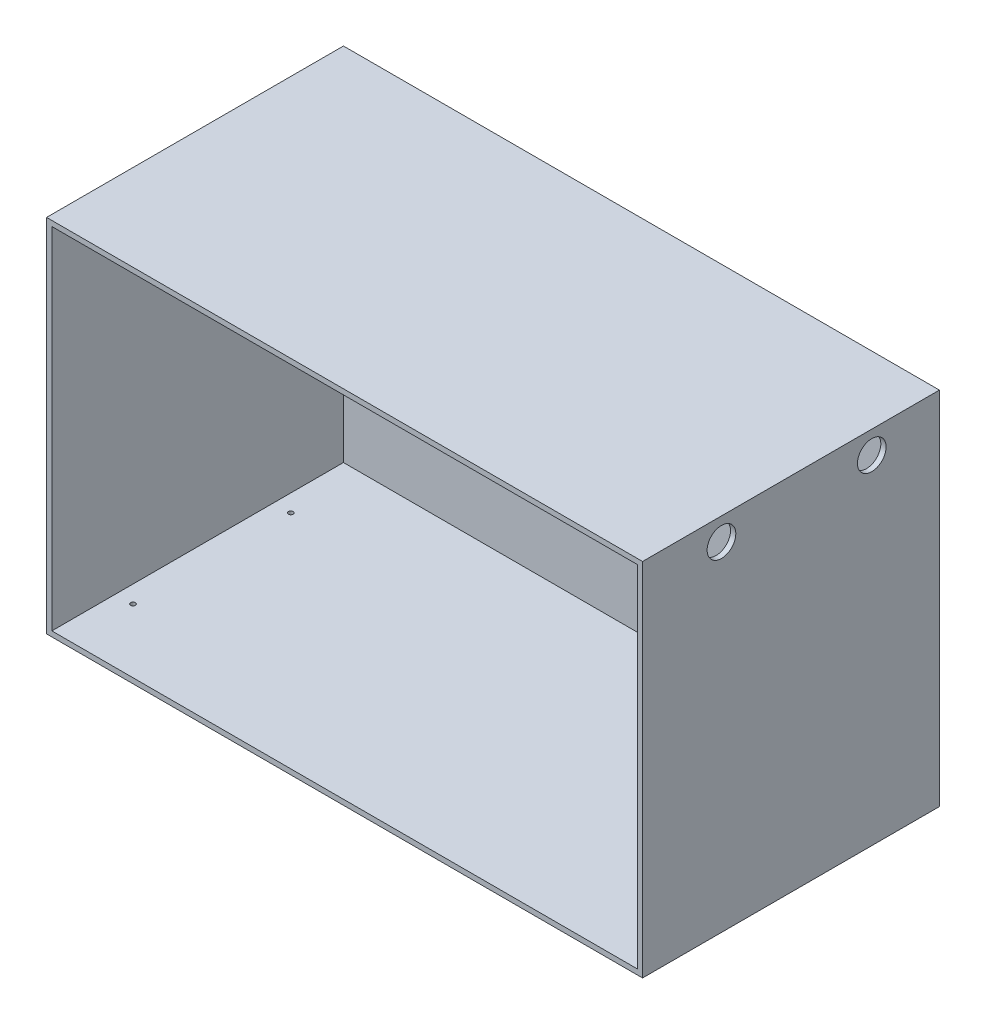
ISO-10303-21;
HEADER;
FILE_DESCRIPTION(('STEP AP214'),'2;1');
FILE_NAME('part.step','',(''),(''),'','','');
FILE_SCHEMA(('AUTOMOTIVE_DESIGN { 1 0 10303 214 1 1 1 1 }'));
ENDSEC;
DATA;
#1=APPLICATION_CONTEXT('core data for automotive mechanical design processes');
#2=APPLICATION_PROTOCOL_DEFINITION('international standard','automotive_design',2000,#1);
#3=PRODUCT_CONTEXT('',#1,'mechanical');
#4=PRODUCT('Part','Part','',(#3));
#5=PRODUCT_RELATED_PRODUCT_CATEGORY('part','',(#4));
#6=PRODUCT_DEFINITION_FORMATION('','',#4);
#7=PRODUCT_DEFINITION_CONTEXT('part definition',#1,'design');
#8=PRODUCT_DEFINITION('design','',#6,#7);
#9=PRODUCT_DEFINITION_SHAPE('','',#8);
#10=(LENGTH_UNIT() NAMED_UNIT(*) SI_UNIT(.MILLI.,.METRE.));
#11=(NAMED_UNIT(*) PLANE_ANGLE_UNIT() SI_UNIT($,.RADIAN.));
#12=(NAMED_UNIT(*) SI_UNIT($,.STERADIAN.) SOLID_ANGLE_UNIT());
#13=UNCERTAINTY_MEASURE_WITH_UNIT(LENGTH_MEASURE(1.E-05),#10,'distance_accuracy_value','');
#14=(GEOMETRIC_REPRESENTATION_CONTEXT(3) GLOBAL_UNCERTAINTY_ASSIGNED_CONTEXT((#13)) GLOBAL_UNIT_ASSIGNED_CONTEXT((#10,
#11,#12)) REPRESENTATION_CONTEXT('',''));
#15=CARTESIAN_POINT('',(0.,0.,0.));
#16=DIRECTION('',(0.,0.,1.));
#17=DIRECTION('',(1.,0.,0.));
#18=AXIS2_PLACEMENT_3D('',#15,#16,#17);
#19=CARTESIAN_POINT('',(396.5,480.,-220.));
#20=DIRECTION('',(-1.,0.,0.));
#21=DIRECTION('',(0.,0.,1.));
#22=AXIS2_PLACEMENT_3D('',#19,#20,#21);
#23=PLANE('',#22);
#24=CARTESIAN_POINT('',(396.5,450.,70.));
#25=DIRECTION('',(-1.,0.,0.));
#26=DIRECTION('',(0.,0.,1.));
#27=AXIS2_PLACEMENT_3D('',#24,#25,#26);
#28=CIRCLE('',#27,19.05);
#29=CARTESIAN_POINT('',(396.5,450.,89.05));
#30=VERTEX_POINT('',#29);
#31=EDGE_CURVE('E169',#30,#30,#28,.T.);
#32=ORIENTED_EDGE('',*,*,#31,.T.);
#33=EDGE_LOOP('',(#32));
#34=FACE_BOUND('',#33,.T.);
#35=CARTESIAN_POINT('',(396.5,450.,-130.));
#36=DIRECTION('',(-1.,0.,0.));
#37=DIRECTION('',(0.,0.,1.));
#38=AXIS2_PLACEMENT_3D('',#35,#36,#37);
#39=CIRCLE('',#38,19.05);
#40=CARTESIAN_POINT('',(396.5,450.,-110.95));
#41=VERTEX_POINT('',#40);
#42=EDGE_CURVE('E176',#41,#41,#39,.T.);
#43=ORIENTED_EDGE('',*,*,#42,.T.);
#44=EDGE_LOOP('',(#43));
#45=FACE_BOUND('',#44,.T.);
#46=DIRECTION('',(0.,0.,-1.));
#47=VECTOR('',#46,1.);
#48=CARTESIAN_POINT('',(396.5,480.,-220.));
#49=LINE('',#48,#47);
#50=CARTESIAN_POINT('',(396.5,480.,175.));
#51=VERTEX_POINT('',#50);
#52=CARTESIAN_POINT('',(396.5,480.,-220.));
#53=VERTEX_POINT('',#52);
#54=EDGE_CURVE('E106',#51,#53,#49,.T.);
#55=ORIENTED_EDGE('',*,*,#54,.F.);
#56=DIRECTION('',(0.,1.,0.));
#57=VECTOR('',#56,1.);
#58=CARTESIAN_POINT('',(396.5,0.,175.));
#59=LINE('',#58,#57);
#60=CARTESIAN_POINT('',(396.5,0.,175.));
#61=VERTEX_POINT('',#60);
#62=EDGE_CURVE('E94',#61,#51,#59,.T.);
#63=ORIENTED_EDGE('',*,*,#62,.F.);
#64=DIRECTION('',(0.,0.,-1.));
#65=VECTOR('',#64,1.);
#66=CARTESIAN_POINT('',(396.5,0.,-220.));
#67=LINE('',#66,#65);
#68=CARTESIAN_POINT('',(396.5,0.,-220.));
#69=VERTEX_POINT('',#68);
#70=EDGE_CURVE('E126',#61,#69,#67,.T.);
#71=ORIENTED_EDGE('',*,*,#70,.T.);
#72=DIRECTION('',(0.,-1.,0.));
#73=VECTOR('',#72,1.);
#74=CARTESIAN_POINT('',(396.5,480.,-220.));
#75=LINE('',#74,#73);
#76=EDGE_CURVE('E40',#53,#69,#75,.T.);
#77=ORIENTED_EDGE('',*,*,#76,.F.);
#78=EDGE_LOOP('',(#55,#63,#71,#77));
#79=FACE_BOUND('',#78,.T.);
#80=ADVANCED_FACE('F33',(#34,#45,#79),#23,.F.);
#81=CARTESIAN_POINT('',(-396.5,480.,-220.));
#82=DIRECTION('',(0.,0.,1.));
#83=DIRECTION('',(1.,0.,0.));
#84=AXIS2_PLACEMENT_3D('',#81,#82,#83);
#85=PLANE('',#84);
#86=DIRECTION('',(-1.,0.,0.));
#87=VECTOR('',#86,1.);
#88=CARTESIAN_POINT('',(-396.5,0.,-220.));
#89=LINE('',#88,#87);
#90=CARTESIAN_POINT('',(-396.5,0.,-220.));
#91=VERTEX_POINT('',#90);
#92=EDGE_CURVE('E118',#69,#91,#89,.T.);
#93=ORIENTED_EDGE('',*,*,#92,.T.);
#94=DIRECTION('',(0.,-1.,0.));
#95=VECTOR('',#94,1.);
#96=CARTESIAN_POINT('',(-396.5,480.,-220.));
#97=LINE('',#96,#95);
#98=CARTESIAN_POINT('',(-396.5,480.,-220.));
#99=VERTEX_POINT('',#98);
#100=EDGE_CURVE('E125',#99,#91,#97,.T.);
#101=ORIENTED_EDGE('',*,*,#100,.F.);
#102=DIRECTION('',(-1.,0.,0.));
#103=VECTOR('',#102,1.);
#104=CARTESIAN_POINT('',(-396.5,480.,-220.));
#105=LINE('',#104,#103);
#106=EDGE_CURVE('E113',#53,#99,#105,.T.);
#107=ORIENTED_EDGE('',*,*,#106,.F.);
#108=ORIENTED_EDGE('',*,*,#76,.T.);
#109=EDGE_LOOP('',(#93,#101,#107,#108));
#110=FACE_BOUND('',#109,.T.);
#111=ADVANCED_FACE('F236',(#110),#85,.F.);
#112=CARTESIAN_POINT('',(-396.5,480.,-220.));
#113=DIRECTION('',(1.,0.,0.));
#114=DIRECTION('',(0.,0.,-1.));
#115=AXIS2_PLACEMENT_3D('',#112,#113,#114);
#116=PLANE('',#115);
#117=CARTESIAN_POINT('',(-396.5,450.,70.));
#118=DIRECTION('',(-1.,0.,0.));
#119=DIRECTION('',(0.,0.,1.));
#120=AXIS2_PLACEMENT_3D('',#117,#118,#119);
#121=CIRCLE('',#120,19.05);
#122=CARTESIAN_POINT('',(-396.5,450.,89.05));
#123=VERTEX_POINT('',#122);
#124=EDGE_CURVE('E142',#123,#123,#121,.T.);
#125=ORIENTED_EDGE('',*,*,#124,.F.);
#126=EDGE_LOOP('',(#125));
#127=FACE_BOUND('',#126,.T.);
#128=CARTESIAN_POINT('',(-396.5,450.,-130.));
#129=DIRECTION('',(-1.,0.,0.));
#130=DIRECTION('',(0.,0.,1.));
#131=AXIS2_PLACEMENT_3D('',#128,#129,#130);
#132=CIRCLE('',#131,19.05);
#133=CARTESIAN_POINT('',(-396.5,450.,-110.95));
#134=VERTEX_POINT('',#133);
#135=EDGE_CURVE('E137',#134,#134,#132,.T.);
#136=ORIENTED_EDGE('',*,*,#135,.F.);
#137=EDGE_LOOP('',(#136));
#138=FACE_BOUND('',#137,.T.);
#139=DIRECTION('',(0.,0.,1.));
#140=VECTOR('',#139,1.);
#141=CARTESIAN_POINT('',(-396.5,0.,-220.));
#142=LINE('',#141,#140);
#143=CARTESIAN_POINT('',(-396.5,0.,175.));
#144=VERTEX_POINT('',#143);
#145=EDGE_CURVE('E114',#91,#144,#142,.T.);
#146=ORIENTED_EDGE('',*,*,#145,.T.);
#147=DIRECTION('',(0.,-1.,0.));
#148=VECTOR('',#147,1.);
#149=CARTESIAN_POINT('',(-396.5,0.,175.));
#150=LINE('',#149,#148);
#151=CARTESIAN_POINT('',(-396.5,480.,175.));
#152=VERTEX_POINT('',#151);
#153=EDGE_CURVE('E47',#152,#144,#150,.T.);
#154=ORIENTED_EDGE('',*,*,#153,.F.);
#155=DIRECTION('',(0.,0.,1.));
#156=VECTOR('',#155,1.);
#157=CARTESIAN_POINT('',(-396.5,480.,-220.));
#158=LINE('',#157,#156);
#159=EDGE_CURVE('E109',#99,#152,#158,.T.);
#160=ORIENTED_EDGE('',*,*,#159,.F.);
#161=ORIENTED_EDGE('',*,*,#100,.T.);
#162=EDGE_LOOP('',(#146,#154,#160,#161));
#163=FACE_BOUND('',#162,.T.);
#164=ADVANCED_FACE('F238',(#127,#138,#163),#116,.F.);
#165=CARTESIAN_POINT('',(0.,480.,0.));
#166=DIRECTION('',(0.,1.,0.));
#167=DIRECTION('',(0.,0.,1.));
#168=AXIS2_PLACEMENT_3D('',#165,#166,#167);
#169=PLANE('',#168);
#170=DIRECTION('',(-1.,0.,0.));
#171=VECTOR('',#170,1.);
#172=CARTESIAN_POINT('',(-396.5,480.,175.));
#173=LINE('',#172,#171);
#174=EDGE_CURVE('E97',#51,#152,#173,.T.);
#175=ORIENTED_EDGE('',*,*,#174,.F.);
#176=ORIENTED_EDGE('',*,*,#54,.T.);
#177=ORIENTED_EDGE('',*,*,#106,.T.);
#178=ORIENTED_EDGE('',*,*,#159,.T.);
#179=EDGE_LOOP('',(#175,#176,#177,#178));
#180=FACE_BOUND('',#179,.T.);
#181=ADVANCED_FACE('F105',(#180),#169,.T.);
#182=CARTESIAN_POINT('',(0.,0.,0.));
#183=DIRECTION('',(0.,1.,0.));
#184=DIRECTION('',(0.,0.,1.));
#185=AXIS2_PLACEMENT_3D('',#182,#183,#184);
#186=PLANE('',#185);
#187=CARTESIAN_POINT('',(366.5,0.,-120.));
#188=DIRECTION('',(0.,-1.,0.));
#189=DIRECTION('',(0.,0.,1.));
#190=AXIS2_PLACEMENT_3D('',#187,#188,#189);
#191=CIRCLE('',#190,3.17499999999997);
#192=CARTESIAN_POINT('',(366.5,0.,-116.825));
#193=VERTEX_POINT('',#192);
#194=EDGE_CURVE('E151',#193,#193,#191,.T.);
#195=ORIENTED_EDGE('',*,*,#194,.F.);
#196=EDGE_LOOP('',(#195));
#197=FACE_BOUND('',#196,.T.);
#198=CARTESIAN_POINT('',(-366.5,0.,90.));
#199=DIRECTION('',(0.,-1.,0.));
#200=DIRECTION('',(0.,0.,1.));
#201=AXIS2_PLACEMENT_3D('',#198,#199,#200);
#202=CIRCLE('',#201,3.17499999999997);
#203=CARTESIAN_POINT('',(-366.5,0.,93.175));
#204=VERTEX_POINT('',#203);
#205=EDGE_CURVE('E216',#204,#204,#202,.T.);
#206=ORIENTED_EDGE('',*,*,#205,.F.);
#207=EDGE_LOOP('',(#206));
#208=FACE_BOUND('',#207,.T.);
#209=CARTESIAN_POINT('',(366.5,0.,90.));
#210=DIRECTION('',(0.,-1.,0.));
#211=DIRECTION('',(0.,0.,-1.));
#212=AXIS2_PLACEMENT_3D('',#209,#210,#211);
#213=CIRCLE('',#212,3.17499999999997);
#214=CARTESIAN_POINT('',(366.5,0.,86.825));
#215=VERTEX_POINT('',#214);
#216=EDGE_CURVE('E163',#215,#215,#213,.T.);
#217=ORIENTED_EDGE('',*,*,#216,.F.);
#218=EDGE_LOOP('',(#217));
#219=FACE_BOUND('',#218,.T.);
#220=CARTESIAN_POINT('',(-366.5,0.,-120.));
#221=DIRECTION('',(0.,-1.,0.));
#222=DIRECTION('',(0.,0.,-1.));
#223=AXIS2_PLACEMENT_3D('',#220,#221,#222);
#224=CIRCLE('',#223,3.17499999999997);
#225=CARTESIAN_POINT('',(-366.5,0.,-123.175));
#226=VERTEX_POINT('',#225);
#227=EDGE_CURVE('E146',#226,#226,#224,.T.);
#228=ORIENTED_EDGE('',*,*,#227,.F.);
#229=EDGE_LOOP('',(#228));
#230=FACE_BOUND('',#229,.T.);
#231=ORIENTED_EDGE('',*,*,#70,.F.);
#232=DIRECTION('',(1.,0.,0.));
#233=VECTOR('',#232,1.);
#234=CARTESIAN_POINT('',(-396.5,0.,175.));
#235=LINE('',#234,#233);
#236=EDGE_CURVE('E98',#144,#61,#235,.T.);
#237=ORIENTED_EDGE('',*,*,#236,.F.);
#238=ORIENTED_EDGE('',*,*,#145,.F.);
#239=ORIENTED_EDGE('',*,*,#92,.F.);
#240=EDGE_LOOP('',(#231,#237,#238,#239));
#241=FACE_BOUND('',#240,.T.);
#242=ADVANCED_FACE('F225',(#197,#208,#219,#230,#241),#186,.F.);
#243=CARTESIAN_POINT('',(389.5,480.,-220.));
#244=DIRECTION('',(-1.,0.,0.));
#245=DIRECTION('',(0.,0.,1.));
#246=AXIS2_PLACEMENT_3D('',#243,#244,#245);
#247=PLANE('',#246);
#248=DIRECTION('',(0.,-1.,0.));
#249=VECTOR('',#248,1.);
#250=CARTESIAN_POINT('',(389.5,480.,175.));
#251=LINE('',#250,#249);
#252=CARTESIAN_POINT('',(389.5,473.,175.));
#253=VERTEX_POINT('',#252);
#254=CARTESIAN_POINT('',(389.5,7.00000000000001,175.));
#255=VERTEX_POINT('',#254);
#256=EDGE_CURVE('E54',#253,#255,#251,.T.);
#257=ORIENTED_EDGE('',*,*,#256,.F.);
#258=DIRECTION('',(0.,0.,-1.));
#259=VECTOR('',#258,1.);
#260=CARTESIAN_POINT('',(389.5,473.,-220.));
#261=LINE('',#260,#259);
#262=CARTESIAN_POINT('',(389.5,473.,-213.));
#263=VERTEX_POINT('',#262);
#264=EDGE_CURVE('E185',#253,#263,#261,.T.);
#265=ORIENTED_EDGE('',*,*,#264,.T.);
#266=DIRECTION('',(0.,-1.,0.));
#267=VECTOR('',#266,1.);
#268=CARTESIAN_POINT('',(389.5,480.,-213.));
#269=LINE('',#268,#267);
#270=CARTESIAN_POINT('',(389.5,7.,-213.));
#271=VERTEX_POINT('',#270);
#272=EDGE_CURVE('E128',#263,#271,#269,.T.);
#273=ORIENTED_EDGE('',*,*,#272,.T.);
#274=DIRECTION('',(0.,0.,-1.));
#275=VECTOR('',#274,1.);
#276=CARTESIAN_POINT('',(389.5,7.00000000000001,-220.));
#277=LINE('',#276,#275);
#278=EDGE_CURVE('E179',#255,#271,#277,.T.);
#279=ORIENTED_EDGE('',*,*,#278,.F.);
#280=EDGE_LOOP('',(#257,#265,#273,#279));
#281=FACE_BOUND('',#280,.T.);
#282=CARTESIAN_POINT('',(389.5,450.,70.));
#283=DIRECTION('',(-1.,0.,0.));
#284=DIRECTION('',(0.,0.,1.));
#285=AXIS2_PLACEMENT_3D('',#282,#283,#284);
#286=CIRCLE('',#285,19.05);
#287=CARTESIAN_POINT('',(389.5,450.,89.05));
#288=VERTEX_POINT('',#287);
#289=EDGE_CURVE('E141',#288,#288,#286,.T.);
#290=ORIENTED_EDGE('',*,*,#289,.F.);
#291=EDGE_LOOP('',(#290));
#292=FACE_BOUND('',#291,.T.);
#293=CARTESIAN_POINT('',(389.5,450.,-130.));
#294=DIRECTION('',(-1.,0.,0.));
#295=DIRECTION('',(0.,0.,1.));
#296=AXIS2_PLACEMENT_3D('',#293,#294,#295);
#297=CIRCLE('',#296,19.05);
#298=CARTESIAN_POINT('',(389.5,450.,-110.95));
#299=VERTEX_POINT('',#298);
#300=EDGE_CURVE('E136',#299,#299,#297,.T.);
#301=ORIENTED_EDGE('',*,*,#300,.F.);
#302=EDGE_LOOP('',(#301));
#303=FACE_BOUND('',#302,.T.);
#304=ADVANCED_FACE('F228',(#281,#292,#303),#247,.T.);
#305=CARTESIAN_POINT('',(-396.5,480.,-213.));
#306=DIRECTION('',(0.,0.,1.));
#307=DIRECTION('',(1.,0.,0.));
#308=AXIS2_PLACEMENT_3D('',#305,#306,#307);
#309=PLANE('',#308);
#310=DIRECTION('',(-1.,0.,0.));
#311=VECTOR('',#310,1.);
#312=CARTESIAN_POINT('',(-396.5,7.00000000000001,-213.));
#313=LINE('',#312,#311);
#314=CARTESIAN_POINT('',(-389.5,7.,-213.));
#315=VERTEX_POINT('',#314);
#316=EDGE_CURVE('E181',#271,#315,#313,.T.);
#317=ORIENTED_EDGE('',*,*,#316,.F.);
#318=ORIENTED_EDGE('',*,*,#272,.F.);
#319=DIRECTION('',(-1.,0.,0.));
#320=VECTOR('',#319,1.);
#321=CARTESIAN_POINT('',(-396.5,473.,-213.));
#322=LINE('',#321,#320);
#323=CARTESIAN_POINT('',(-389.5,473.,-213.));
#324=VERTEX_POINT('',#323);
#325=EDGE_CURVE('E187',#263,#324,#322,.T.);
#326=ORIENTED_EDGE('',*,*,#325,.T.);
#327=DIRECTION('',(0.,-1.,0.));
#328=VECTOR('',#327,1.);
#329=CARTESIAN_POINT('',(-389.5,480.,-213.));
#330=LINE('',#329,#328);
#331=EDGE_CURVE('E184',#324,#315,#330,.T.);
#332=ORIENTED_EDGE('',*,*,#331,.T.);
#333=EDGE_LOOP('',(#317,#318,#326,#332));
#334=FACE_BOUND('',#333,.T.);
#335=ADVANCED_FACE('F275',(#334),#309,.T.);
#336=CARTESIAN_POINT('',(-389.5,480.,-220.));
#337=DIRECTION('',(1.,0.,0.));
#338=DIRECTION('',(0.,0.,-1.));
#339=AXIS2_PLACEMENT_3D('',#336,#337,#338);
#340=PLANE('',#339);
#341=DIRECTION('',(0.,1.,0.));
#342=VECTOR('',#341,1.);
#343=CARTESIAN_POINT('',(-389.5,480.,175.));
#344=LINE('',#343,#342);
#345=CARTESIAN_POINT('',(-389.5,7.,175.));
#346=VERTEX_POINT('',#345);
#347=CARTESIAN_POINT('',(-389.5,473.,175.));
#348=VERTEX_POINT('',#347);
#349=EDGE_CURVE('E206',#346,#348,#344,.T.);
#350=ORIENTED_EDGE('',*,*,#349,.F.);
#351=DIRECTION('',(0.,0.,1.));
#352=VECTOR('',#351,1.);
#353=CARTESIAN_POINT('',(-389.5,7.00000000000001,-220.));
#354=LINE('',#353,#352);
#355=EDGE_CURVE('E188',#315,#346,#354,.T.);
#356=ORIENTED_EDGE('',*,*,#355,.F.);
#357=ORIENTED_EDGE('',*,*,#331,.F.);
#358=DIRECTION('',(0.,0.,1.));
#359=VECTOR('',#358,1.);
#360=CARTESIAN_POINT('',(-389.5,473.,-220.));
#361=LINE('',#360,#359);
#362=EDGE_CURVE('E121',#324,#348,#361,.T.);
#363=ORIENTED_EDGE('',*,*,#362,.T.);
#364=EDGE_LOOP('',(#350,#356,#357,#363));
#365=FACE_BOUND('',#364,.T.);
#366=CARTESIAN_POINT('',(-389.5,450.,70.));
#367=DIRECTION('',(1.,0.,0.));
#368=DIRECTION('',(0.,0.,-1.));
#369=AXIS2_PLACEMENT_3D('',#366,#367,#368);
#370=CIRCLE('',#369,19.05);
#371=CARTESIAN_POINT('',(-389.5,450.,50.95));
#372=VERTEX_POINT('',#371);
#373=EDGE_CURVE('E138',#372,#372,#370,.T.);
#374=ORIENTED_EDGE('',*,*,#373,.F.);
#375=EDGE_LOOP('',(#374));
#376=FACE_BOUND('',#375,.T.);
#377=CARTESIAN_POINT('',(-389.5,450.,-130.));
#378=DIRECTION('',(1.,0.,0.));
#379=DIRECTION('',(0.,0.,-1.));
#380=AXIS2_PLACEMENT_3D('',#377,#378,#379);
#381=CIRCLE('',#380,19.05);
#382=CARTESIAN_POINT('',(-389.5,450.,-149.05));
#383=VERTEX_POINT('',#382);
#384=EDGE_CURVE('E133',#383,#383,#381,.T.);
#385=ORIENTED_EDGE('',*,*,#384,.F.);
#386=EDGE_LOOP('',(#385));
#387=FACE_BOUND('',#386,.T.);
#388=ADVANCED_FACE('F202',(#365,#376,#387),#340,.T.);
#389=CARTESIAN_POINT('',(0.,473.,0.));
#390=DIRECTION('',(0.,1.,0.));
#391=DIRECTION('',(0.,0.,1.));
#392=AXIS2_PLACEMENT_3D('',#389,#390,#391);
#393=PLANE('',#392);
#394=ORIENTED_EDGE('',*,*,#264,.F.);
#395=DIRECTION('',(-1.,0.,0.));
#396=VECTOR('',#395,1.);
#397=CARTESIAN_POINT('',(0.,473.,175.));
#398=LINE('',#397,#396);
#399=EDGE_CURVE('E209',#253,#348,#398,.T.);
#400=ORIENTED_EDGE('',*,*,#399,.T.);
#401=ORIENTED_EDGE('',*,*,#362,.F.);
#402=ORIENTED_EDGE('',*,*,#325,.F.);
#403=EDGE_LOOP('',(#394,#400,#401,#402));
#404=FACE_BOUND('',#403,.T.);
#405=ADVANCED_FACE('F282',(#404),#393,.F.);
#406=CARTESIAN_POINT('',(0.,7.,0.));
#407=DIRECTION('',(0.,1.,0.));
#408=DIRECTION('',(0.,0.,1.));
#409=AXIS2_PLACEMENT_3D('',#406,#407,#408);
#410=PLANE('',#409);
#411=DIRECTION('',(-1.,0.,0.));
#412=VECTOR('',#411,1.);
#413=CARTESIAN_POINT('',(0.,7.,175.));
#414=LINE('',#413,#412);
#415=EDGE_CURVE('E11',#255,#346,#414,.T.);
#416=ORIENTED_EDGE('',*,*,#415,.F.);
#417=ORIENTED_EDGE('',*,*,#278,.T.);
#418=ORIENTED_EDGE('',*,*,#316,.T.);
#419=ORIENTED_EDGE('',*,*,#355,.T.);
#420=EDGE_LOOP('',(#416,#417,#418,#419));
#421=FACE_BOUND('',#420,.T.);
#422=CARTESIAN_POINT('',(366.5,7.,-120.));
#423=DIRECTION('',(0.,1.,0.));
#424=DIRECTION('',(0.,0.,1.));
#425=AXIS2_PLACEMENT_3D('',#422,#423,#424);
#426=CIRCLE('',#425,3.17499999999997);
#427=CARTESIAN_POINT('',(366.5,7.,-116.825));
#428=VERTEX_POINT('',#427);
#429=EDGE_CURVE('E153',#428,#428,#426,.T.);
#430=ORIENTED_EDGE('',*,*,#429,.F.);
#431=EDGE_LOOP('',(#430));
#432=FACE_BOUND('',#431,.T.);
#433=CARTESIAN_POINT('',(-366.5,7.,90.));
#434=DIRECTION('',(0.,1.,0.));
#435=DIRECTION('',(0.,0.,1.));
#436=AXIS2_PLACEMENT_3D('',#433,#434,#435);
#437=CIRCLE('',#436,3.17499999999997);
#438=CARTESIAN_POINT('',(-366.5,7.,93.175));
#439=VERTEX_POINT('',#438);
#440=EDGE_CURVE('E150',#439,#439,#437,.T.);
#441=ORIENTED_EDGE('',*,*,#440,.F.);
#442=EDGE_LOOP('',(#441));
#443=FACE_BOUND('',#442,.T.);
#444=CARTESIAN_POINT('',(366.5,7.,90.));
#445=DIRECTION('',(0.,1.,0.));
#446=DIRECTION('',(0.,0.,1.));
#447=AXIS2_PLACEMENT_3D('',#444,#445,#446);
#448=CIRCLE('',#447,3.17499999999997);
#449=CARTESIAN_POINT('',(366.5,7.,93.175));
#450=VERTEX_POINT('',#449);
#451=EDGE_CURVE('E147',#450,#450,#448,.T.);
#452=ORIENTED_EDGE('',*,*,#451,.F.);
#453=EDGE_LOOP('',(#452));
#454=FACE_BOUND('',#453,.T.);
#455=CARTESIAN_POINT('',(-366.5,7.,-120.));
#456=DIRECTION('',(0.,1.,0.));
#457=DIRECTION('',(0.,0.,1.));
#458=AXIS2_PLACEMENT_3D('',#455,#456,#457);
#459=CIRCLE('',#458,3.17499999999997);
#460=CARTESIAN_POINT('',(-366.5,7.,-116.825));
#461=VERTEX_POINT('',#460);
#462=EDGE_CURVE('E143',#461,#461,#459,.T.);
#463=ORIENTED_EDGE('',*,*,#462,.F.);
#464=EDGE_LOOP('',(#463));
#465=FACE_BOUND('',#464,.T.);
#466=ADVANCED_FACE('F195',(#421,#432,#443,#454,#465),#410,.T.);
#467=CARTESIAN_POINT('',(451.5,450.,-130.));
#468=DIRECTION('',(-1.,0.,0.));
#469=DIRECTION('',(0.,0.,1.));
#470=AXIS2_PLACEMENT_3D('',#467,#468,#469);
#471=CYLINDRICAL_SURFACE('',#470,19.05);
#472=ORIENTED_EDGE('',*,*,#384,.T.);
#473=EDGE_LOOP('',(#472));
#474=FACE_BOUND('',#473,.T.);
#475=ORIENTED_EDGE('',*,*,#135,.T.);
#476=EDGE_LOOP('',(#475));
#477=FACE_BOUND('',#476,.T.);
#478=ADVANCED_FACE('F260',(#474,#477),#471,.F.);
#479=ORIENTED_EDGE('',*,*,#300,.T.);
#480=EDGE_LOOP('',(#479));
#481=FACE_BOUND('',#480,.T.);
#482=ORIENTED_EDGE('',*,*,#42,.F.);
#483=EDGE_LOOP('',(#482));
#484=FACE_BOUND('',#483,.T.);
#485=ADVANCED_FACE('F257',(#481,#484),#471,.F.);
#486=CARTESIAN_POINT('',(451.5,450.,70.));
#487=DIRECTION('',(-1.,0.,0.));
#488=DIRECTION('',(0.,0.,1.));
#489=AXIS2_PLACEMENT_3D('',#486,#487,#488);
#490=CYLINDRICAL_SURFACE('',#489,19.05);
#491=ORIENTED_EDGE('',*,*,#373,.T.);
#492=EDGE_LOOP('',(#491));
#493=FACE_BOUND('',#492,.T.);
#494=ORIENTED_EDGE('',*,*,#124,.T.);
#495=EDGE_LOOP('',(#494));
#496=FACE_BOUND('',#495,.T.);
#497=ADVANCED_FACE('F259',(#493,#496),#490,.F.);
#498=ORIENTED_EDGE('',*,*,#289,.T.);
#499=EDGE_LOOP('',(#498));
#500=FACE_BOUND('',#499,.T.);
#501=ORIENTED_EDGE('',*,*,#31,.F.);
#502=EDGE_LOOP('',(#501));
#503=FACE_BOUND('',#502,.T.);
#504=ADVANCED_FACE('F267',(#500,#503),#490,.F.);
#505=CARTESIAN_POINT('',(-366.5,10.,-120.));
#506=DIRECTION('',(0.,-1.,0.));
#507=DIRECTION('',(0.,0.,-1.));
#508=AXIS2_PLACEMENT_3D('',#505,#506,#507);
#509=CYLINDRICAL_SURFACE('',#508,3.17499999999997);
#510=ORIENTED_EDGE('',*,*,#462,.T.);
#511=EDGE_LOOP('',(#510));
#512=FACE_BOUND('',#511,.T.);
#513=ORIENTED_EDGE('',*,*,#227,.T.);
#514=EDGE_LOOP('',(#513));
#515=FACE_BOUND('',#514,.T.);
#516=ADVANCED_FACE('F317',(#512,#515),#509,.F.);
#517=CARTESIAN_POINT('',(366.5,10.,90.));
#518=DIRECTION('',(0.,-1.,0.));
#519=DIRECTION('',(0.,0.,-1.));
#520=AXIS2_PLACEMENT_3D('',#517,#518,#519);
#521=CYLINDRICAL_SURFACE('',#520,3.17499999999997);
#522=ORIENTED_EDGE('',*,*,#451,.T.);
#523=EDGE_LOOP('',(#522));
#524=FACE_BOUND('',#523,.T.);
#525=ORIENTED_EDGE('',*,*,#216,.T.);
#526=EDGE_LOOP('',(#525));
#527=FACE_BOUND('',#526,.T.);
#528=ADVANCED_FACE('F223',(#524,#527),#521,.F.);
#529=CARTESIAN_POINT('',(-366.5,10.,90.));
#530=DIRECTION('',(0.,-1.,0.));
#531=DIRECTION('',(0.,0.,-1.));
#532=AXIS2_PLACEMENT_3D('',#529,#530,#531);
#533=CYLINDRICAL_SURFACE('',#532,3.17499999999997);
#534=ORIENTED_EDGE('',*,*,#440,.T.);
#535=EDGE_LOOP('',(#534));
#536=FACE_BOUND('',#535,.T.);
#537=ORIENTED_EDGE('',*,*,#205,.T.);
#538=EDGE_LOOP('',(#537));
#539=FACE_BOUND('',#538,.T.);
#540=ADVANCED_FACE('F336',(#536,#539),#533,.F.);
#541=CARTESIAN_POINT('',(366.5,10.,-120.));
#542=DIRECTION('',(0.,-1.,0.));
#543=DIRECTION('',(0.,0.,-1.));
#544=AXIS2_PLACEMENT_3D('',#541,#542,#543);
#545=CYLINDRICAL_SURFACE('',#544,3.17499999999997);
#546=ORIENTED_EDGE('',*,*,#429,.T.);
#547=EDGE_LOOP('',(#546));
#548=FACE_BOUND('',#547,.T.);
#549=ORIENTED_EDGE('',*,*,#194,.T.);
#550=EDGE_LOOP('',(#549));
#551=FACE_BOUND('',#550,.T.);
#552=ADVANCED_FACE('F346',(#548,#551),#545,.F.);
#553=CARTESIAN_POINT('',(0.,0.,175.));
#554=DIRECTION('',(0.,0.,-1.));
#555=DIRECTION('',(-1.,0.,0.));
#556=AXIS2_PLACEMENT_3D('',#553,#554,#555);
#557=PLANE('',#556);
#558=ORIENTED_EDGE('',*,*,#62,.T.);
#559=ORIENTED_EDGE('',*,*,#174,.T.);
#560=ORIENTED_EDGE('',*,*,#153,.T.);
#561=ORIENTED_EDGE('',*,*,#236,.T.);
#562=EDGE_LOOP('',(#558,#559,#560,#561));
#563=FACE_BOUND('',#562,.T.);
#564=ORIENTED_EDGE('',*,*,#256,.T.);
#565=ORIENTED_EDGE('',*,*,#415,.T.);
#566=ORIENTED_EDGE('',*,*,#349,.T.);
#567=ORIENTED_EDGE('',*,*,#399,.F.);
#568=EDGE_LOOP('',(#564,#565,#566,#567));
#569=FACE_BOUND('',#568,.T.);
#570=ADVANCED_FACE('F96',(#563,#569),#557,.F.);
#571=CLOSED_SHELL('',(#80,#111,#164,#181,#242,#304,#335,#388,#405,#466,#478,#485,#497,#504,#516,
#528,#540,#552,#570));
#572=MANIFOLD_SOLID_BREP('B2',#571);
#573=ADVANCED_BREP_SHAPE_REPRESENTATION('',(#18,#572),#14);
#574=SHAPE_DEFINITION_REPRESENTATION(#9,#573);
ENDSEC;
END-ISO-10303-21;
